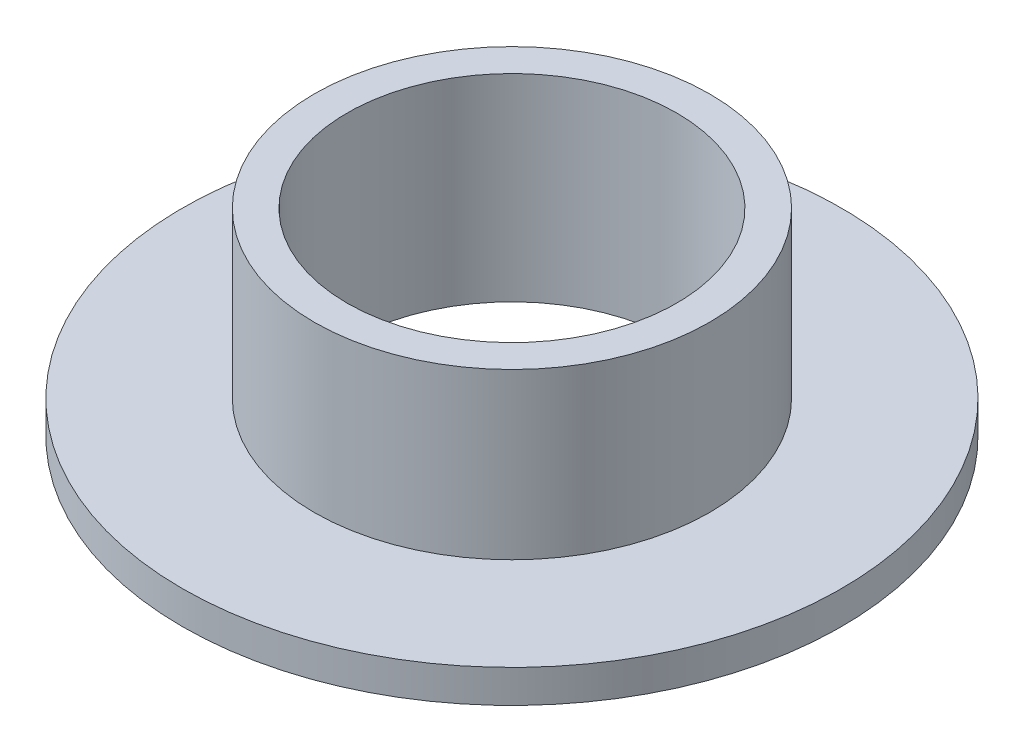
ISO-10303-21;
HEADER;
FILE_DESCRIPTION(('STEP AP214'),'2;1');
FILE_NAME('part.step','',(''),(''),'','','');
FILE_SCHEMA(('AUTOMOTIVE_DESIGN { 1 0 10303 214 1 1 1 1 }'));
ENDSEC;
DATA;
#1=APPLICATION_CONTEXT('core data for automotive mechanical design processes');
#2=APPLICATION_PROTOCOL_DEFINITION('international standard','automotive_design',2000,#1);
#3=PRODUCT_CONTEXT('',#1,'mechanical');
#4=PRODUCT('Part','Part','',(#3));
#5=PRODUCT_RELATED_PRODUCT_CATEGORY('part','',(#4));
#6=PRODUCT_DEFINITION_FORMATION('','',#4);
#7=PRODUCT_DEFINITION_CONTEXT('part definition',#1,'design');
#8=PRODUCT_DEFINITION('design','',#6,#7);
#9=PRODUCT_DEFINITION_SHAPE('','',#8);
#10=(LENGTH_UNIT() NAMED_UNIT(*) SI_UNIT(.MILLI.,.METRE.));
#11=(NAMED_UNIT(*) PLANE_ANGLE_UNIT() SI_UNIT($,.RADIAN.));
#12=(NAMED_UNIT(*) SI_UNIT($,.STERADIAN.) SOLID_ANGLE_UNIT());
#13=UNCERTAINTY_MEASURE_WITH_UNIT(LENGTH_MEASURE(1.E-05),#10,'distance_accuracy_value','');
#14=(GEOMETRIC_REPRESENTATION_CONTEXT(3) GLOBAL_UNCERTAINTY_ASSIGNED_CONTEXT((#13)) GLOBAL_UNIT_ASSIGNED_CONTEXT((#10,
#11,#12)) REPRESENTATION_CONTEXT('',''));
#15=CARTESIAN_POINT('',(0.,0.,0.));
#16=DIRECTION('',(0.,0.,1.));
#17=DIRECTION('',(1.,0.,0.));
#18=AXIS2_PLACEMENT_3D('',#15,#16,#17);
#19=CARTESIAN_POINT('',(0.,5.,0.));
#20=DIRECTION('',(0.,1.,0.));
#21=DIRECTION('',(0.,0.,1.));
#22=AXIS2_PLACEMENT_3D('',#19,#20,#21);
#23=PLANE('',#22);
#24=CARTESIAN_POINT('',(0.,5.,0.));
#25=DIRECTION('',(0.,1.,0.));
#26=DIRECTION('',(0.,0.,1.));
#27=AXIS2_PLACEMENT_3D('',#24,#25,#26);
#28=CIRCLE('',#27,50.);
#29=CARTESIAN_POINT('',(0.,5.,50.));
#30=VERTEX_POINT('',#29);
#31=EDGE_CURVE('E10',#30,#30,#28,.T.);
#32=ORIENTED_EDGE('',*,*,#31,.T.);
#33=EDGE_LOOP('',(#32));
#34=FACE_BOUND('',#33,.T.);
#35=CARTESIAN_POINT('',(0.,5.,0.));
#36=DIRECTION('',(0.,1.,0.));
#37=DIRECTION('',(0.,0.,1.));
#38=AXIS2_PLACEMENT_3D('',#35,#36,#37);
#39=CIRCLE('',#38,30.);
#40=CARTESIAN_POINT('',(0.,5.,30.));
#41=VERTEX_POINT('',#40);
#42=EDGE_CURVE('E56',#41,#41,#39,.T.);
#43=ORIENTED_EDGE('',*,*,#42,.F.);
#44=EDGE_LOOP('',(#43));
#45=FACE_BOUND('',#44,.T.);
#46=ADVANCED_FACE('F37',(#34,#45),#23,.T.);
#47=CARTESIAN_POINT('',(0.,0.,0.));
#48=DIRECTION('',(0.,1.,0.));
#49=DIRECTION('',(0.,0.,1.));
#50=AXIS2_PLACEMENT_3D('',#47,#48,#49);
#51=PLANE('',#50);
#52=CARTESIAN_POINT('',(0.,0.,0.));
#53=DIRECTION('',(0.,1.,0.));
#54=DIRECTION('',(0.,0.,1.));
#55=AXIS2_PLACEMENT_3D('',#52,#53,#54);
#56=CIRCLE('',#55,50.);
#57=CARTESIAN_POINT('',(0.,0.,50.));
#58=VERTEX_POINT('',#57);
#59=EDGE_CURVE('E41',#58,#58,#56,.T.);
#60=ORIENTED_EDGE('',*,*,#59,.F.);
#61=EDGE_LOOP('',(#60));
#62=FACE_BOUND('',#61,.T.);
#63=CARTESIAN_POINT('',(0.,0.,0.));
#64=DIRECTION('',(0.,1.,0.));
#65=DIRECTION('',(0.,0.,1.));
#66=AXIS2_PLACEMENT_3D('',#63,#64,#65);
#67=CIRCLE('',#66,25.);
#68=CARTESIAN_POINT('',(0.,0.,25.));
#69=VERTEX_POINT('',#68);
#70=EDGE_CURVE('E50',#69,#69,#67,.T.);
#71=ORIENTED_EDGE('',*,*,#70,.T.);
#72=EDGE_LOOP('',(#71));
#73=FACE_BOUND('',#72,.T.);
#74=ADVANCED_FACE('F84',(#62,#73),#51,.F.);
#75=CARTESIAN_POINT('',(0.,5.,0.));
#76=DIRECTION('',(0.,-1.,0.));
#77=DIRECTION('',(0.,0.,-1.));
#78=AXIS2_PLACEMENT_3D('',#75,#76,#77);
#79=CYLINDRICAL_SURFACE('',#78,50.);
#80=ORIENTED_EDGE('',*,*,#31,.F.);
#81=EDGE_LOOP('',(#80));
#82=FACE_BOUND('',#81,.T.);
#83=ORIENTED_EDGE('',*,*,#59,.T.);
#84=EDGE_LOOP('',(#83));
#85=FACE_BOUND('',#84,.T.);
#86=ADVANCED_FACE('F39',(#82,#85),#79,.T.);
#87=CARTESIAN_POINT('',(0.,5.,0.));
#88=DIRECTION('',(0.,-1.,0.));
#89=DIRECTION('',(0.,0.,-1.));
#90=AXIS2_PLACEMENT_3D('',#87,#88,#89);
#91=CYLINDRICAL_SURFACE('',#90,25.);
#92=ORIENTED_EDGE('',*,*,#70,.F.);
#93=EDGE_LOOP('',(#92));
#94=FACE_BOUND('',#93,.T.);
#95=CARTESIAN_POINT('',(0.,30.,0.));
#96=DIRECTION('',(0.,1.,0.));
#97=DIRECTION('',(0.,0.,1.));
#98=AXIS2_PLACEMENT_3D('',#95,#96,#97);
#99=CIRCLE('',#98,25.);
#100=CARTESIAN_POINT('',(0.,30.,25.));
#101=VERTEX_POINT('',#100);
#102=EDGE_CURVE('E60',#101,#101,#99,.T.);
#103=ORIENTED_EDGE('',*,*,#102,.T.);
#104=EDGE_LOOP('',(#103));
#105=FACE_BOUND('',#104,.T.);
#106=ADVANCED_FACE('F68',(#94,#105),#91,.F.);
#107=CARTESIAN_POINT('',(0.,30.,0.));
#108=DIRECTION('',(0.,1.,0.));
#109=DIRECTION('',(0.,0.,1.));
#110=AXIS2_PLACEMENT_3D('',#107,#108,#109);
#111=PLANE('',#110);
#112=CARTESIAN_POINT('',(0.,30.,0.));
#113=DIRECTION('',(0.,1.,0.));
#114=DIRECTION('',(0.,0.,1.));
#115=AXIS2_PLACEMENT_3D('',#112,#113,#114);
#116=CIRCLE('',#115,30.);
#117=CARTESIAN_POINT('',(0.,30.,30.));
#118=VERTEX_POINT('',#117);
#119=EDGE_CURVE('E55',#118,#118,#116,.T.);
#120=ORIENTED_EDGE('',*,*,#119,.T.);
#121=EDGE_LOOP('',(#120));
#122=FACE_BOUND('',#121,.T.);
#123=ORIENTED_EDGE('',*,*,#102,.F.);
#124=EDGE_LOOP('',(#123));
#125=FACE_BOUND('',#124,.T.);
#126=ADVANCED_FACE('F70',(#122,#125),#111,.T.);
#127=CARTESIAN_POINT('',(0.,30.,0.));
#128=DIRECTION('',(0.,-1.,0.));
#129=DIRECTION('',(0.,0.,-1.));
#130=AXIS2_PLACEMENT_3D('',#127,#128,#129);
#131=CYLINDRICAL_SURFACE('',#130,30.);
#132=ORIENTED_EDGE('',*,*,#119,.F.);
#133=EDGE_LOOP('',(#132));
#134=FACE_BOUND('',#133,.T.);
#135=ORIENTED_EDGE('',*,*,#42,.T.);
#136=EDGE_LOOP('',(#135));
#137=FACE_BOUND('',#136,.T.);
#138=ADVANCED_FACE('F72',(#134,#137),#131,.T.);
#139=CLOSED_SHELL('',(#46,#74,#86,#106,#126,#138));
#140=MANIFOLD_SOLID_BREP('B2',#139);
#141=ADVANCED_BREP_SHAPE_REPRESENTATION('',(#18,#140),#14);
#142=SHAPE_DEFINITION_REPRESENTATION(#9,#141);
ENDSEC;
END-ISO-10303-21;
